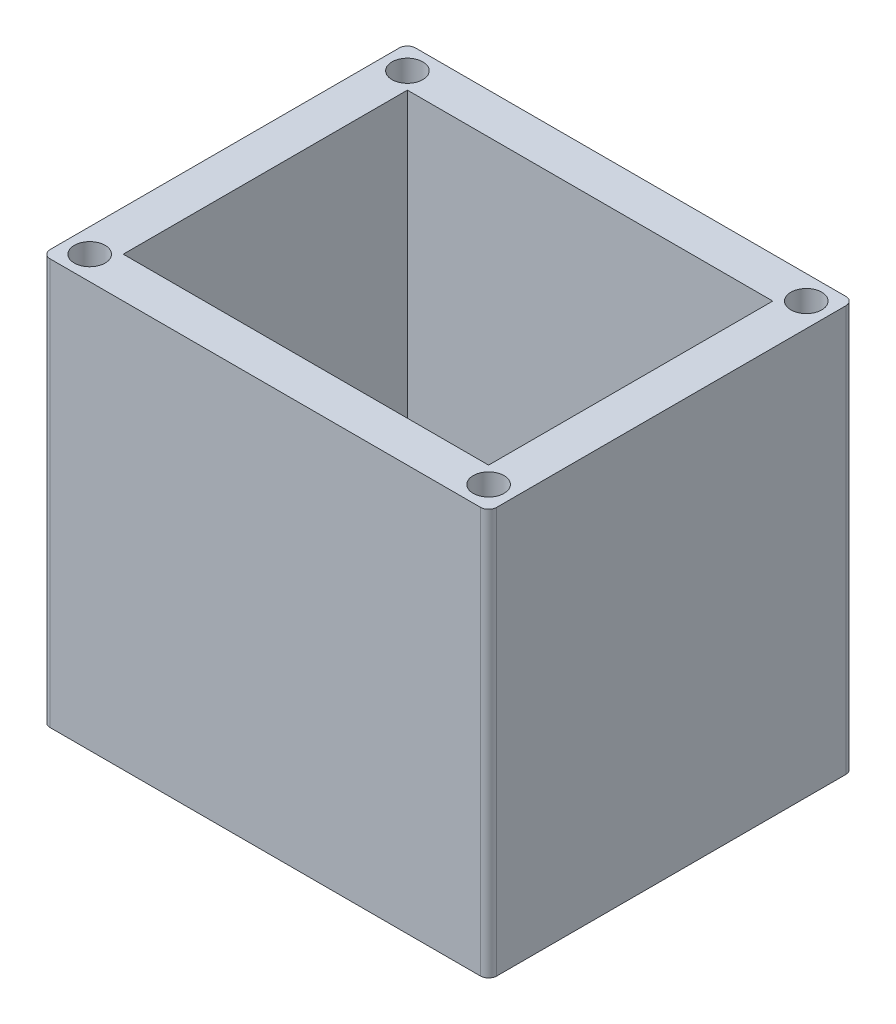
ISO-10303-21;
HEADER;
FILE_DESCRIPTION(('STEP AP214'),'2;1');
FILE_NAME('part.step','',(''),(''),'','','');
FILE_SCHEMA(('AUTOMOTIVE_DESIGN { 1 0 10303 214 1 1 1 1 }'));
ENDSEC;
DATA;
#1=APPLICATION_CONTEXT('core data for automotive mechanical design processes');
#2=APPLICATION_PROTOCOL_DEFINITION('international standard','automotive_design',2000,#1);
#3=PRODUCT_CONTEXT('',#1,'mechanical');
#4=PRODUCT('Part','Part','',(#3));
#5=PRODUCT_RELATED_PRODUCT_CATEGORY('part','',(#4));
#6=PRODUCT_DEFINITION_FORMATION('','',#4);
#7=PRODUCT_DEFINITION_CONTEXT('part definition',#1,'design');
#8=PRODUCT_DEFINITION('design','',#6,#7);
#9=PRODUCT_DEFINITION_SHAPE('','',#8);
#10=(LENGTH_UNIT() NAMED_UNIT(*) SI_UNIT(.MILLI.,.METRE.));
#11=(NAMED_UNIT(*) PLANE_ANGLE_UNIT() SI_UNIT($,.RADIAN.));
#12=(NAMED_UNIT(*) SI_UNIT($,.STERADIAN.) SOLID_ANGLE_UNIT());
#13=UNCERTAINTY_MEASURE_WITH_UNIT(LENGTH_MEASURE(1.E-05),#10,'distance_accuracy_value','');
#14=(GEOMETRIC_REPRESENTATION_CONTEXT(3) GLOBAL_UNCERTAINTY_ASSIGNED_CONTEXT((#13)) GLOBAL_UNIT_ASSIGNED_CONTEXT((#10,
#11,#12)) REPRESENTATION_CONTEXT('',''));
#15=CARTESIAN_POINT('',(0.,0.,0.));
#16=DIRECTION('',(0.,0.,1.));
#17=DIRECTION('',(1.,0.,0.));
#18=AXIS2_PLACEMENT_3D('',#15,#16,#17);
#19=CARTESIAN_POINT('',(0.,50.,45.));
#20=DIRECTION('',(1.,0.,0.));
#21=DIRECTION('',(0.,0.,-1.));
#22=AXIS2_PLACEMENT_3D('',#19,#20,#21);
#23=PLANE('',#22);
#24=DIRECTION('',(0.,1.,0.));
#25=VECTOR('',#24,1.);
#26=CARTESIAN_POINT('',(0.,50.,38.5));
#27=LINE('',#26,#25);
#28=CARTESIAN_POINT('',(0.,13.5172402704764,38.5));
#29=VERTEX_POINT('',#28);
#30=CARTESIAN_POINT('',(0.,6.5,38.5));
#31=VERTEX_POINT('',#30);
#32=EDGE_CURVE('E226',#29,#31,#27,.F.);
#33=ORIENTED_EDGE('',*,*,#32,.T.);
#34=DIRECTION('',(0.,0.,1.));
#35=VECTOR('',#34,1.);
#36=CARTESIAN_POINT('',(0.,6.5,45.));
#37=LINE('',#36,#35);
#38=CARTESIAN_POINT('',(0.,6.5,6.5));
#39=VERTEX_POINT('',#38);
#40=EDGE_CURVE('E232',#31,#39,#37,.F.);
#41=ORIENTED_EDGE('',*,*,#40,.T.);
#42=DIRECTION('',(0.,-1.,0.));
#43=VECTOR('',#42,1.);
#44=CARTESIAN_POINT('',(0.,50.,6.49999999999999));
#45=LINE('',#44,#43);
#46=CARTESIAN_POINT('',(0.,12.9702266472342,6.5));
#47=VERTEX_POINT('',#46);
#48=EDGE_CURVE('E230',#39,#47,#45,.F.);
#49=ORIENTED_EDGE('',*,*,#48,.T.);
#50=DIRECTION('',(0.,-0.0170916787217876,-0.999853926590515));
#51=VECTOR('',#50,1.);
#52=CARTESIAN_POINT('',(0.,13.6389774977629,45.6215617082418));
#53=LINE('',#52,#51);
#54=EDGE_CURVE('E228',#47,#29,#53,.F.);
#55=ORIENTED_EDGE('',*,*,#54,.T.);
#56=EDGE_LOOP('',(#33,#41,#49,#55));
#57=FACE_BOUND('',#56,.T.);
#58=DIRECTION('',(0.,0.,1.));
#59=VECTOR('',#58,1.);
#60=CARTESIAN_POINT('',(0.,0.,45.));
#61=LINE('',#60,#59);
#62=CARTESIAN_POINT('',(0.,0.,1.00000000000001));
#63=VERTEX_POINT('',#62);
#64=CARTESIAN_POINT('',(0.,0.,44.));
#65=VERTEX_POINT('',#64);
#66=EDGE_CURVE('E334',#63,#65,#61,.T.);
#67=ORIENTED_EDGE('',*,*,#66,.T.);
#68=DIRECTION('',(0.,-1.,0.));
#69=VECTOR('',#68,1.);
#70=CARTESIAN_POINT('',(0.,50.,44.));
#71=LINE('',#70,#69);
#72=CARTESIAN_POINT('',(0.,50.,44.));
#73=VERTEX_POINT('',#72);
#74=EDGE_CURVE('E216',#65,#73,#71,.F.);
#75=ORIENTED_EDGE('',*,*,#74,.T.);
#76=DIRECTION('',(0.,0.,1.));
#77=VECTOR('',#76,1.);
#78=CARTESIAN_POINT('',(0.,50.,45.));
#79=LINE('',#78,#77);
#80=CARTESIAN_POINT('',(0.,50.,1.00000000000001));
#81=VERTEX_POINT('',#80);
#82=EDGE_CURVE('E341',#81,#73,#79,.T.);
#83=ORIENTED_EDGE('',*,*,#82,.F.);
#84=DIRECTION('',(0.,-1.,0.));
#85=VECTOR('',#84,1.);
#86=CARTESIAN_POINT('',(0.,50.,1.));
#87=LINE('',#86,#85);
#88=EDGE_CURVE('E213',#81,#63,#87,.T.);
#89=ORIENTED_EDGE('',*,*,#88,.T.);
#90=EDGE_LOOP('',(#67,#75,#83,#89));
#91=FACE_BOUND('',#90,.T.);
#92=ADVANCED_FACE('F37',(#57,#91),#23,.F.);
#93=CARTESIAN_POINT('',(55.,50.,45.));
#94=DIRECTION('',(0.,0.,-1.));
#95=DIRECTION('',(-1.,0.,0.));
#96=AXIS2_PLACEMENT_3D('',#93,#94,#95);
#97=PLANE('',#96);
#98=DIRECTION('',(1.,0.,0.));
#99=VECTOR('',#98,1.);
#100=CARTESIAN_POINT('',(55.,0.,45.));
#101=LINE('',#100,#99);
#102=CARTESIAN_POINT('',(1.00000000000002,0.,45.));
#103=VERTEX_POINT('',#102);
#104=CARTESIAN_POINT('',(54.,0.,45.));
#105=VERTEX_POINT('',#104);
#106=EDGE_CURVE('E355',#103,#105,#101,.T.);
#107=ORIENTED_EDGE('',*,*,#106,.T.);
#108=DIRECTION('',(0.,-1.,0.));
#109=VECTOR('',#108,1.);
#110=CARTESIAN_POINT('',(54.,50.,45.));
#111=LINE('',#110,#109);
#112=CARTESIAN_POINT('',(54.,50.,45.));
#113=VERTEX_POINT('',#112);
#114=EDGE_CURVE('E203',#105,#113,#111,.F.);
#115=ORIENTED_EDGE('',*,*,#114,.T.);
#116=DIRECTION('',(1.,0.,0.));
#117=VECTOR('',#116,1.);
#118=CARTESIAN_POINT('',(55.,50.,45.));
#119=LINE('',#118,#117);
#120=CARTESIAN_POINT('',(1.00000000000002,50.,45.));
#121=VERTEX_POINT('',#120);
#122=EDGE_CURVE('E344',#121,#113,#119,.T.);
#123=ORIENTED_EDGE('',*,*,#122,.F.);
#124=DIRECTION('',(0.,-1.,0.));
#125=VECTOR('',#124,1.);
#126=CARTESIAN_POINT('',(1.00000000000002,50.,45.));
#127=LINE('',#126,#125);
#128=EDGE_CURVE('E200',#121,#103,#127,.T.);
#129=ORIENTED_EDGE('',*,*,#128,.T.);
#130=EDGE_LOOP('',(#107,#115,#123,#129));
#131=FACE_BOUND('',#130,.T.);
#132=ADVANCED_FACE('F385',(#131),#97,.F.);
#133=CARTESIAN_POINT('',(55.,50.,0.));
#134=DIRECTION('',(-1.,0.,0.));
#135=DIRECTION('',(0.,0.,1.));
#136=AXIS2_PLACEMENT_3D('',#133,#134,#135);
#137=PLANE('',#136);
#138=DIRECTION('',(0.,0.,-1.));
#139=VECTOR('',#138,1.);
#140=CARTESIAN_POINT('',(55.,50.,0.));
#141=LINE('',#140,#139);
#142=CARTESIAN_POINT('',(55.,50.,44.));
#143=VERTEX_POINT('',#142);
#144=CARTESIAN_POINT('',(55.,50.,0.999999999999999));
#145=VERTEX_POINT('',#144);
#146=EDGE_CURVE('E348',#143,#145,#141,.T.);
#147=ORIENTED_EDGE('',*,*,#146,.F.);
#148=DIRECTION('',(0.,-1.,0.));
#149=VECTOR('',#148,1.);
#150=CARTESIAN_POINT('',(55.,50.,44.));
#151=LINE('',#150,#149);
#152=CARTESIAN_POINT('',(55.,0.,44.));
#153=VERTEX_POINT('',#152);
#154=EDGE_CURVE('E185',#143,#153,#151,.T.);
#155=ORIENTED_EDGE('',*,*,#154,.T.);
#156=DIRECTION('',(0.,0.,-1.));
#157=VECTOR('',#156,1.);
#158=CARTESIAN_POINT('',(55.,0.,0.));
#159=LINE('',#158,#157);
#160=CARTESIAN_POINT('',(55.,0.,0.999999999999999));
#161=VERTEX_POINT('',#160);
#162=EDGE_CURVE('E358',#153,#161,#159,.T.);
#163=ORIENTED_EDGE('',*,*,#162,.T.);
#164=DIRECTION('',(0.,-1.,0.));
#165=VECTOR('',#164,1.);
#166=CARTESIAN_POINT('',(55.,50.,1.));
#167=LINE('',#166,#165);
#168=EDGE_CURVE('E183',#161,#145,#167,.F.);
#169=ORIENTED_EDGE('',*,*,#168,.T.);
#170=EDGE_LOOP('',(#147,#155,#163,#169));
#171=FACE_BOUND('',#170,.T.);
#172=ADVANCED_FACE('F394',(#171),#137,.F.);
#173=CARTESIAN_POINT('',(0.,50.,0.));
#174=DIRECTION('',(0.,0.,1.));
#175=DIRECTION('',(1.,0.,0.));
#176=AXIS2_PLACEMENT_3D('',#173,#174,#175);
#177=PLANE('',#176);
#178=DIRECTION('',(-1.,0.,0.));
#179=VECTOR('',#178,1.);
#180=CARTESIAN_POINT('',(0.,0.,0.));
#181=LINE('',#180,#179);
#182=CARTESIAN_POINT('',(54.,0.,0.));
#183=VERTEX_POINT('',#182);
#184=CARTESIAN_POINT('',(1.,0.,0.));
#185=VERTEX_POINT('',#184);
#186=EDGE_CURVE('E345',#183,#185,#181,.T.);
#187=ORIENTED_EDGE('',*,*,#186,.T.);
#188=DIRECTION('',(0.,-1.,0.));
#189=VECTOR('',#188,1.);
#190=CARTESIAN_POINT('',(1.,50.,0.));
#191=LINE('',#190,#189);
#192=CARTESIAN_POINT('',(1.,50.,0.));
#193=VERTEX_POINT('',#192);
#194=EDGE_CURVE('E221',#185,#193,#191,.F.);
#195=ORIENTED_EDGE('',*,*,#194,.T.);
#196=DIRECTION('',(-1.,0.,0.));
#197=VECTOR('',#196,1.);
#198=CARTESIAN_POINT('',(0.,50.,0.));
#199=LINE('',#198,#197);
#200=CARTESIAN_POINT('',(54.,50.,0.));
#201=VERTEX_POINT('',#200);
#202=EDGE_CURVE('E174',#201,#193,#199,.T.);
#203=ORIENTED_EDGE('',*,*,#202,.F.);
#204=DIRECTION('',(0.,-1.,0.));
#205=VECTOR('',#204,1.);
#206=CARTESIAN_POINT('',(54.,50.,0.));
#207=LINE('',#206,#205);
#208=EDGE_CURVE('E218',#201,#183,#207,.T.);
#209=ORIENTED_EDGE('',*,*,#208,.T.);
#210=EDGE_LOOP('',(#187,#195,#203,#209));
#211=FACE_BOUND('',#210,.T.);
#212=ADVANCED_FACE('F365',(#211),#177,.F.);
#213=CARTESIAN_POINT('',(0.,50.,0.));
#214=DIRECTION('',(0.,-1.,0.));
#215=DIRECTION('',(0.,0.,-1.));
#216=AXIS2_PLACEMENT_3D('',#213,#214,#215);
#217=PLANE('',#216);
#218=CARTESIAN_POINT('',(2.9352119940451,50.,42.0647880059549));
#219=DIRECTION('',(0.,1.,0.));
#220=DIRECTION('',(0.,0.,1.));
#221=AXIS2_PLACEMENT_3D('',#218,#219,#220);
#222=CIRCLE('',#221,1.9);
#223=CARTESIAN_POINT('',(2.9352119940451,50.,43.9647880059549));
#224=VERTEX_POINT('',#223);
#225=EDGE_CURVE('E298',#224,#224,#222,.T.);
#226=ORIENTED_EDGE('',*,*,#225,.F.);
#227=EDGE_LOOP('',(#226));
#228=FACE_BOUND('',#227,.T.);
#229=CARTESIAN_POINT('',(52.0647880059549,50.,42.0647880059549));
#230=DIRECTION('',(0.,1.,0.));
#231=DIRECTION('',(0.,0.,1.));
#232=AXIS2_PLACEMENT_3D('',#229,#230,#231);
#233=CIRCLE('',#232,1.9);
#234=CARTESIAN_POINT('',(52.0647880059549,50.,43.9647880059549));
#235=VERTEX_POINT('',#234);
#236=EDGE_CURVE('E292',#235,#235,#233,.T.);
#237=ORIENTED_EDGE('',*,*,#236,.F.);
#238=EDGE_LOOP('',(#237));
#239=FACE_BOUND('',#238,.T.);
#240=CARTESIAN_POINT('',(52.0647880059549,50.,2.9352119940451));
#241=DIRECTION('',(0.,1.,0.));
#242=DIRECTION('',(0.,0.,1.));
#243=AXIS2_PLACEMENT_3D('',#240,#241,#242);
#244=CIRCLE('',#243,1.9);
#245=CARTESIAN_POINT('',(52.0647880059549,50.,4.8352119940451));
#246=VERTEX_POINT('',#245);
#247=EDGE_CURVE('E285',#246,#246,#244,.T.);
#248=ORIENTED_EDGE('',*,*,#247,.F.);
#249=EDGE_LOOP('',(#248));
#250=FACE_BOUND('',#249,.T.);
#251=CARTESIAN_POINT('',(2.93521199404509,50.,2.9352119940451));
#252=DIRECTION('',(0.,1.,0.));
#253=DIRECTION('',(0.,0.,1.));
#254=AXIS2_PLACEMENT_3D('',#251,#252,#253);
#255=CIRCLE('',#254,1.9);
#256=CARTESIAN_POINT('',(2.93521199404509,50.,4.8352119940451));
#257=VERTEX_POINT('',#256);
#258=EDGE_CURVE('E288',#257,#257,#255,.T.);
#259=ORIENTED_EDGE('',*,*,#258,.F.);
#260=EDGE_LOOP('',(#259));
#261=FACE_BOUND('',#260,.T.);
#262=DIRECTION('',(0.,0.,1.));
#263=VECTOR('',#262,1.);
#264=CARTESIAN_POINT('',(5.,50.,5.00000000000001));
#265=LINE('',#264,#263);
#266=CARTESIAN_POINT('',(5.,50.,5.00000000000001));
#267=VERTEX_POINT('',#266);
#268=CARTESIAN_POINT('',(5.,50.,40.));
#269=VERTEX_POINT('',#268);
#270=EDGE_CURVE('E324',#267,#269,#265,.T.);
#271=ORIENTED_EDGE('',*,*,#270,.F.);
#272=DIRECTION('',(-1.,0.,0.));
#273=VECTOR('',#272,1.);
#274=CARTESIAN_POINT('',(50.,50.,5.));
#275=LINE('',#274,#273);
#276=CARTESIAN_POINT('',(50.,50.,5.));
#277=VERTEX_POINT('',#276);
#278=EDGE_CURVE('E306',#277,#267,#275,.T.);
#279=ORIENTED_EDGE('',*,*,#278,.F.);
#280=DIRECTION('',(0.,0.,-1.));
#281=VECTOR('',#280,1.);
#282=CARTESIAN_POINT('',(50.,50.,40.));
#283=LINE('',#282,#281);
#284=CARTESIAN_POINT('',(50.,50.,40.));
#285=VERTEX_POINT('',#284);
#286=EDGE_CURVE('E313',#285,#277,#283,.T.);
#287=ORIENTED_EDGE('',*,*,#286,.F.);
#288=DIRECTION('',(1.,0.,0.));
#289=VECTOR('',#288,1.);
#290=CARTESIAN_POINT('',(5.,50.,40.));
#291=LINE('',#290,#289);
#292=EDGE_CURVE('E327',#269,#285,#291,.T.);
#293=ORIENTED_EDGE('',*,*,#292,.F.);
#294=EDGE_LOOP('',(#271,#279,#287,#293));
#295=FACE_BOUND('',#294,.T.);
#296=ORIENTED_EDGE('',*,*,#122,.T.);
#297=CARTESIAN_POINT('',(54.,50.,44.));
#298=DIRECTION('',(0.,-1.,0.));
#299=DIRECTION('',(0.,0.,-1.));
#300=AXIS2_PLACEMENT_3D('',#297,#298,#299);
#301=CIRCLE('',#300,1.);
#302=EDGE_CURVE('E211',#113,#143,#301,.F.);
#303=ORIENTED_EDGE('',*,*,#302,.T.);
#304=ORIENTED_EDGE('',*,*,#146,.T.);
#305=CARTESIAN_POINT('',(54.,50.,1.));
#306=DIRECTION('',(0.,-1.,0.));
#307=DIRECTION('',(0.,0.,-1.));
#308=AXIS2_PLACEMENT_3D('',#305,#306,#307);
#309=CIRCLE('',#308,1.);
#310=EDGE_CURVE('E205',#145,#201,#309,.F.);
#311=ORIENTED_EDGE('',*,*,#310,.T.);
#312=ORIENTED_EDGE('',*,*,#202,.T.);
#313=CARTESIAN_POINT('',(1.,50.,1.));
#314=DIRECTION('',(0.,-1.,0.));
#315=DIRECTION('',(0.,0.,-1.));
#316=AXIS2_PLACEMENT_3D('',#313,#314,#315);
#317=CIRCLE('',#316,1.);
#318=EDGE_CURVE('E207',#193,#81,#317,.F.);
#319=ORIENTED_EDGE('',*,*,#318,.T.);
#320=ORIENTED_EDGE('',*,*,#82,.T.);
#321=CARTESIAN_POINT('',(1.00000000000002,50.,44.));
#322=DIRECTION('',(0.,-1.,0.));
#323=DIRECTION('',(0.,0.,-1.));
#324=AXIS2_PLACEMENT_3D('',#321,#322,#323);
#325=CIRCLE('',#324,1.);
#326=EDGE_CURVE('E209',#73,#121,#325,.F.);
#327=ORIENTED_EDGE('',*,*,#326,.T.);
#328=EDGE_LOOP('',(#296,#303,#304,#311,#312,#319,#320,#327));
#329=FACE_BOUND('',#328,.T.);
#330=ADVANCED_FACE('F375',(#228,#239,#250,#261,#295,#329),#217,.F.);
#331=CARTESIAN_POINT('',(0.,0.,0.));
#332=DIRECTION('',(0.,-1.,0.));
#333=DIRECTION('',(0.,0.,-1.));
#334=AXIS2_PLACEMENT_3D('',#331,#332,#333);
#335=PLANE('',#334);
#336=CARTESIAN_POINT('',(13.75,0.,22.5));
#337=DIRECTION('',(0.,-1.,0.));
#338=DIRECTION('',(0.,0.,-1.));
#339=AXIS2_PLACEMENT_3D('',#336,#337,#338);
#340=CIRCLE('',#339,1.6);
#341=CARTESIAN_POINT('',(13.75,0.,20.9));
#342=VERTEX_POINT('',#341);
#343=EDGE_CURVE('E281',#342,#342,#340,.T.);
#344=ORIENTED_EDGE('',*,*,#343,.F.);
#345=EDGE_LOOP('',(#344));
#346=FACE_BOUND('',#345,.T.);
#347=CARTESIAN_POINT('',(41.25,0.,22.5));
#348=DIRECTION('',(0.,-1.,0.));
#349=DIRECTION('',(0.,0.,-1.));
#350=AXIS2_PLACEMENT_3D('',#347,#348,#349);
#351=CIRCLE('',#350,1.6);
#352=CARTESIAN_POINT('',(41.25,0.,20.9));
#353=VERTEX_POINT('',#352);
#354=EDGE_CURVE('E276',#353,#353,#351,.T.);
#355=ORIENTED_EDGE('',*,*,#354,.F.);
#356=EDGE_LOOP('',(#355));
#357=FACE_BOUND('',#356,.T.);
#358=ORIENTED_EDGE('',*,*,#162,.F.);
#359=CARTESIAN_POINT('',(54.,0.,44.));
#360=DIRECTION('',(0.,-1.,0.));
#361=DIRECTION('',(0.,0.,-1.));
#362=AXIS2_PLACEMENT_3D('',#359,#360,#361);
#363=CIRCLE('',#362,1.);
#364=EDGE_CURVE('E198',#153,#105,#363,.T.);
#365=ORIENTED_EDGE('',*,*,#364,.T.);
#366=ORIENTED_EDGE('',*,*,#106,.F.);
#367=CARTESIAN_POINT('',(1.00000000000002,0.,44.));
#368=DIRECTION('',(0.,-1.,0.));
#369=DIRECTION('',(0.,0.,-1.));
#370=AXIS2_PLACEMENT_3D('',#367,#368,#369);
#371=CIRCLE('',#370,1.);
#372=EDGE_CURVE('E196',#103,#65,#371,.T.);
#373=ORIENTED_EDGE('',*,*,#372,.T.);
#374=ORIENTED_EDGE('',*,*,#66,.F.);
#375=CARTESIAN_POINT('',(1.,0.,1.));
#376=DIRECTION('',(0.,-1.,0.));
#377=DIRECTION('',(0.,0.,-1.));
#378=AXIS2_PLACEMENT_3D('',#375,#376,#377);
#379=CIRCLE('',#378,1.);
#380=EDGE_CURVE('E194',#63,#185,#379,.T.);
#381=ORIENTED_EDGE('',*,*,#380,.T.);
#382=ORIENTED_EDGE('',*,*,#186,.F.);
#383=CARTESIAN_POINT('',(54.,0.,1.));
#384=DIRECTION('',(0.,-1.,0.));
#385=DIRECTION('',(0.,0.,-1.));
#386=AXIS2_PLACEMENT_3D('',#383,#384,#385);
#387=CIRCLE('',#386,1.);
#388=EDGE_CURVE('E192',#183,#161,#387,.T.);
#389=ORIENTED_EDGE('',*,*,#388,.T.);
#390=EDGE_LOOP('',(#358,#365,#366,#373,#374,#381,#382,#389));
#391=FACE_BOUND('',#390,.T.);
#392=ADVANCED_FACE('F399',(#346,#357,#391),#335,.T.);
#393=CARTESIAN_POINT('',(50.,5.,5.));
#394=DIRECTION('',(0.,0.,-1.));
#395=DIRECTION('',(-1.,0.,0.));
#396=AXIS2_PLACEMENT_3D('',#393,#394,#395);
#397=PLANE('',#396);
#398=ORIENTED_EDGE('',*,*,#278,.T.);
#399=DIRECTION('',(0.,1.,0.));
#400=VECTOR('',#399,1.);
#401=CARTESIAN_POINT('',(5.,5.,5.00000000000001));
#402=LINE('',#401,#400);
#403=CARTESIAN_POINT('',(5.,5.,5.00000000000001));
#404=VERTEX_POINT('',#403);
#405=EDGE_CURVE('E322',#404,#267,#402,.T.);
#406=ORIENTED_EDGE('',*,*,#405,.F.);
#407=DIRECTION('',(-1.,0.,0.));
#408=VECTOR('',#407,1.);
#409=CARTESIAN_POINT('',(50.,5.,5.));
#410=LINE('',#409,#408);
#411=CARTESIAN_POINT('',(50.,5.,5.));
#412=VERTEX_POINT('',#411);
#413=EDGE_CURVE('E309',#412,#404,#410,.T.);
#414=ORIENTED_EDGE('',*,*,#413,.F.);
#415=DIRECTION('',(0.,1.,0.));
#416=VECTOR('',#415,1.);
#417=CARTESIAN_POINT('',(50.,5.,5.));
#418=LINE('',#417,#416);
#419=EDGE_CURVE('E332',#412,#277,#418,.T.);
#420=ORIENTED_EDGE('',*,*,#419,.T.);
#421=EDGE_LOOP('',(#398,#406,#414,#420));
#422=FACE_BOUND('',#421,.T.);
#423=ADVANCED_FACE('F401',(#422),#397,.F.);
#424=CARTESIAN_POINT('',(50.,5.,40.));
#425=DIRECTION('',(1.,0.,0.));
#426=DIRECTION('',(0.,0.,-1.));
#427=AXIS2_PLACEMENT_3D('',#424,#425,#426);
#428=PLANE('',#427);
#429=ORIENTED_EDGE('',*,*,#286,.T.);
#430=ORIENTED_EDGE('',*,*,#419,.F.);
#431=DIRECTION('',(0.,0.,-1.));
#432=VECTOR('',#431,1.);
#433=CARTESIAN_POINT('',(50.,5.,40.));
#434=LINE('',#433,#432);
#435=CARTESIAN_POINT('',(50.,5.,40.));
#436=VERTEX_POINT('',#435);
#437=EDGE_CURVE('E319',#436,#412,#434,.T.);
#438=ORIENTED_EDGE('',*,*,#437,.F.);
#439=DIRECTION('',(0.,1.,0.));
#440=VECTOR('',#439,1.);
#441=CARTESIAN_POINT('',(50.,5.,40.));
#442=LINE('',#441,#440);
#443=EDGE_CURVE('E335',#436,#285,#442,.T.);
#444=ORIENTED_EDGE('',*,*,#443,.T.);
#445=EDGE_LOOP('',(#429,#430,#438,#444));
#446=FACE_BOUND('',#445,.T.);
#447=ADVANCED_FACE('F408',(#446),#428,.F.);
#448=CARTESIAN_POINT('',(5.,5.,40.));
#449=DIRECTION('',(0.,0.,1.));
#450=DIRECTION('',(1.,0.,0.));
#451=AXIS2_PLACEMENT_3D('',#448,#449,#450);
#452=PLANE('',#451);
#453=ORIENTED_EDGE('',*,*,#292,.T.);
#454=ORIENTED_EDGE('',*,*,#443,.F.);
#455=DIRECTION('',(1.,0.,0.));
#456=VECTOR('',#455,1.);
#457=CARTESIAN_POINT('',(5.,5.,40.));
#458=LINE('',#457,#456);
#459=CARTESIAN_POINT('',(5.,5.,40.));
#460=VERTEX_POINT('',#459);
#461=EDGE_CURVE('E316',#460,#436,#458,.T.);
#462=ORIENTED_EDGE('',*,*,#461,.F.);
#463=DIRECTION('',(0.,1.,0.));
#464=VECTOR('',#463,1.);
#465=CARTESIAN_POINT('',(5.,5.,40.));
#466=LINE('',#465,#464);
#467=EDGE_CURVE('E337',#460,#269,#466,.T.);
#468=ORIENTED_EDGE('',*,*,#467,.T.);
#469=EDGE_LOOP('',(#453,#454,#462,#468));
#470=FACE_BOUND('',#469,.T.);
#471=ADVANCED_FACE('F576',(#470),#452,.F.);
#472=CARTESIAN_POINT('',(5.,5.,5.00000000000001));
#473=DIRECTION('',(-1.,0.,0.));
#474=DIRECTION('',(0.,0.,1.));
#475=AXIS2_PLACEMENT_3D('',#472,#473,#474);
#476=PLANE('',#475);
#477=DIRECTION('',(0.,1.,0.));
#478=VECTOR('',#477,1.);
#479=CARTESIAN_POINT('',(5.,5.,37.5));
#480=LINE('',#479,#478);
#481=CARTESIAN_POINT('',(5.,7.5,37.5));
#482=VERTEX_POINT('',#481);
#483=CARTESIAN_POINT('',(5.,12.5,37.5));
#484=VERTEX_POINT('',#483);
#485=EDGE_CURVE('E182',#482,#484,#480,.T.);
#486=ORIENTED_EDGE('',*,*,#485,.T.);
#487=DIRECTION('',(0.,-0.0170916787217876,-0.999853926590515));
#488=VECTOR('',#487,1.);
#489=CARTESIAN_POINT('',(5.,11.9424106412234,4.88132521253467));
#490=LINE('',#489,#488);
#491=CARTESIAN_POINT('',(5.,11.9871747282105,7.5));
#492=VERTEX_POINT('',#491);
#493=EDGE_CURVE('E177',#484,#492,#490,.T.);
#494=ORIENTED_EDGE('',*,*,#493,.T.);
#495=DIRECTION('',(0.,-1.,0.));
#496=VECTOR('',#495,1.);
#497=CARTESIAN_POINT('',(5.,5.00000000000001,7.5));
#498=LINE('',#497,#496);
#499=CARTESIAN_POINT('',(5.,7.5,7.5));
#500=VERTEX_POINT('',#499);
#501=EDGE_CURVE('E163',#492,#500,#498,.T.);
#502=ORIENTED_EDGE('',*,*,#501,.T.);
#503=DIRECTION('',(0.,0.,1.));
#504=VECTOR('',#503,1.);
#505=CARTESIAN_POINT('',(5.,7.5,5.00000000000001));
#506=LINE('',#505,#504);
#507=EDGE_CURVE('E173',#500,#482,#506,.T.);
#508=ORIENTED_EDGE('',*,*,#507,.T.);
#509=EDGE_LOOP('',(#486,#494,#502,#508));
#510=FACE_BOUND('',#509,.T.);
#511=ORIENTED_EDGE('',*,*,#270,.T.);
#512=ORIENTED_EDGE('',*,*,#467,.F.);
#513=DIRECTION('',(0.,0.,1.));
#514=VECTOR('',#513,1.);
#515=CARTESIAN_POINT('',(5.,5.,5.00000000000001));
#516=LINE('',#515,#514);
#517=EDGE_CURVE('E312',#404,#460,#516,.T.);
#518=ORIENTED_EDGE('',*,*,#517,.F.);
#519=ORIENTED_EDGE('',*,*,#405,.T.);
#520=EDGE_LOOP('',(#511,#512,#518,#519));
#521=FACE_BOUND('',#520,.T.);
#522=ADVANCED_FACE('F180',(#510,#521),#476,.F.);
#523=CARTESIAN_POINT('',(0.,5.,0.));
#524=DIRECTION('',(0.,1.,0.));
#525=DIRECTION('',(0.,0.,1.));
#526=AXIS2_PLACEMENT_3D('',#523,#524,#525);
#527=PLANE('',#526);
#528=CARTESIAN_POINT('',(13.75,5.,22.5));
#529=DIRECTION('',(0.,1.,0.));
#530=DIRECTION('',(0.,0.,1.));
#531=AXIS2_PLACEMENT_3D('',#528,#529,#530);
#532=CIRCLE('',#531,1.6);
#533=CARTESIAN_POINT('',(13.75,5.,24.1));
#534=VERTEX_POINT('',#533);
#535=EDGE_CURVE('E273',#534,#534,#532,.T.);
#536=ORIENTED_EDGE('',*,*,#535,.F.);
#537=EDGE_LOOP('',(#536));
#538=FACE_BOUND('',#537,.T.);
#539=CARTESIAN_POINT('',(41.25,5.,22.5));
#540=DIRECTION('',(0.,1.,0.));
#541=DIRECTION('',(0.,0.,1.));
#542=AXIS2_PLACEMENT_3D('',#539,#540,#541);
#543=CIRCLE('',#542,1.6);
#544=CARTESIAN_POINT('',(41.25,5.,24.1));
#545=VERTEX_POINT('',#544);
#546=EDGE_CURVE('E269',#545,#545,#543,.T.);
#547=ORIENTED_EDGE('',*,*,#546,.F.);
#548=EDGE_LOOP('',(#547));
#549=FACE_BOUND('',#548,.T.);
#550=ORIENTED_EDGE('',*,*,#413,.T.);
#551=ORIENTED_EDGE('',*,*,#517,.T.);
#552=ORIENTED_EDGE('',*,*,#461,.T.);
#553=ORIENTED_EDGE('',*,*,#437,.T.);
#554=EDGE_LOOP('',(#550,#551,#552,#553));
#555=FACE_BOUND('',#554,.T.);
#556=ADVANCED_FACE('F562',(#538,#549,#555),#527,.T.);
#557=CARTESIAN_POINT('',(2.93521199404509,30.,2.9352119940451));
#558=DIRECTION('',(0.,1.,0.));
#559=DIRECTION('',(0.,0.,1.));
#560=AXIS2_PLACEMENT_3D('',#557,#558,#559);
#561=CYLINDRICAL_SURFACE('',#560,1.9);
#562=CARTESIAN_POINT('',(2.93521199404509,30.,2.9352119940451));
#563=DIRECTION('',(0.,1.,0.));
#564=DIRECTION('',(0.,0.,1.));
#565=AXIS2_PLACEMENT_3D('',#562,#563,#564);
#566=CIRCLE('',#565,1.9);
#567=CARTESIAN_POINT('',(2.93521199404509,30.,4.8352119940451));
#568=VERTEX_POINT('',#567);
#569=EDGE_CURVE('E303',#568,#568,#566,.T.);
#570=ORIENTED_EDGE('',*,*,#569,.F.);
#571=EDGE_LOOP('',(#570));
#572=FACE_BOUND('',#571,.T.);
#573=ORIENTED_EDGE('',*,*,#258,.T.);
#574=EDGE_LOOP('',(#573));
#575=FACE_BOUND('',#574,.T.);
#576=ADVANCED_FACE('F554',(#572,#575),#561,.F.);
#577=CARTESIAN_POINT('',(2.93521199404509,30.,2.9352119940451));
#578=DIRECTION('',(0.,1.,0.));
#579=DIRECTION('',(0.,0.,1.));
#580=AXIS2_PLACEMENT_3D('',#577,#578,#579);
#581=PLANE('',#580);
#582=ORIENTED_EDGE('',*,*,#569,.T.);
#583=EDGE_LOOP('',(#582));
#584=FACE_BOUND('',#583,.T.);
#585=ADVANCED_FACE('F546',(#584),#581,.T.);
#586=CARTESIAN_POINT('',(52.0647880059549,30.,2.9352119940451));
#587=DIRECTION('',(0.,1.,0.));
#588=DIRECTION('',(0.,0.,1.));
#589=AXIS2_PLACEMENT_3D('',#586,#587,#588);
#590=CYLINDRICAL_SURFACE('',#589,1.9);
#591=CARTESIAN_POINT('',(52.0647880059549,30.,2.9352119940451));
#592=DIRECTION('',(0.,1.,0.));
#593=DIRECTION('',(0.,0.,1.));
#594=AXIS2_PLACEMENT_3D('',#591,#592,#593);
#595=CIRCLE('',#594,1.9);
#596=CARTESIAN_POINT('',(52.0647880059549,30.,4.8352119940451));
#597=VERTEX_POINT('',#596);
#598=EDGE_CURVE('E289',#597,#597,#595,.T.);
#599=ORIENTED_EDGE('',*,*,#598,.F.);
#600=EDGE_LOOP('',(#599));
#601=FACE_BOUND('',#600,.T.);
#602=ORIENTED_EDGE('',*,*,#247,.T.);
#603=EDGE_LOOP('',(#602));
#604=FACE_BOUND('',#603,.T.);
#605=ADVANCED_FACE('F538',(#601,#604),#590,.F.);
#606=CARTESIAN_POINT('',(52.0647880059549,30.,2.9352119940451));
#607=DIRECTION('',(0.,1.,0.));
#608=DIRECTION('',(0.,0.,1.));
#609=AXIS2_PLACEMENT_3D('',#606,#607,#608);
#610=PLANE('',#609);
#611=ORIENTED_EDGE('',*,*,#598,.T.);
#612=EDGE_LOOP('',(#611));
#613=FACE_BOUND('',#612,.T.);
#614=ADVANCED_FACE('F530',(#613),#610,.T.);
#615=CARTESIAN_POINT('',(52.0647880059549,30.,42.0647880059549));
#616=DIRECTION('',(0.,1.,0.));
#617=DIRECTION('',(0.,0.,1.));
#618=AXIS2_PLACEMENT_3D('',#615,#616,#617);
#619=CYLINDRICAL_SURFACE('',#618,1.9);
#620=CARTESIAN_POINT('',(52.0647880059549,30.,42.0647880059549));
#621=DIRECTION('',(0.,1.,0.));
#622=DIRECTION('',(0.,0.,1.));
#623=AXIS2_PLACEMENT_3D('',#620,#621,#622);
#624=CIRCLE('',#623,1.9);
#625=CARTESIAN_POINT('',(52.0647880059549,30.,43.9647880059549));
#626=VERTEX_POINT('',#625);
#627=EDGE_CURVE('E295',#626,#626,#624,.T.);
#628=ORIENTED_EDGE('',*,*,#627,.F.);
#629=EDGE_LOOP('',(#628));
#630=FACE_BOUND('',#629,.T.);
#631=ORIENTED_EDGE('',*,*,#236,.T.);
#632=EDGE_LOOP('',(#631));
#633=FACE_BOUND('',#632,.T.);
#634=ADVANCED_FACE('F522',(#630,#633),#619,.F.);
#635=CARTESIAN_POINT('',(52.0647880059549,30.,42.0647880059549));
#636=DIRECTION('',(0.,1.,0.));
#637=DIRECTION('',(0.,0.,1.));
#638=AXIS2_PLACEMENT_3D('',#635,#636,#637);
#639=PLANE('',#638);
#640=ORIENTED_EDGE('',*,*,#627,.T.);
#641=EDGE_LOOP('',(#640));
#642=FACE_BOUND('',#641,.T.);
#643=ADVANCED_FACE('F514',(#642),#639,.T.);
#644=CARTESIAN_POINT('',(2.9352119940451,30.,42.0647880059549));
#645=DIRECTION('',(0.,1.,0.));
#646=DIRECTION('',(0.,0.,1.));
#647=AXIS2_PLACEMENT_3D('',#644,#645,#646);
#648=CYLINDRICAL_SURFACE('',#647,1.9);
#649=CARTESIAN_POINT('',(2.9352119940451,30.,42.0647880059549));
#650=DIRECTION('',(0.,1.,0.));
#651=DIRECTION('',(0.,0.,1.));
#652=AXIS2_PLACEMENT_3D('',#649,#650,#651);
#653=CIRCLE('',#652,1.9);
#654=CARTESIAN_POINT('',(2.9352119940451,30.,43.9647880059549));
#655=VERTEX_POINT('',#654);
#656=EDGE_CURVE('E284',#655,#655,#653,.T.);
#657=ORIENTED_EDGE('',*,*,#656,.F.);
#658=EDGE_LOOP('',(#657));
#659=FACE_BOUND('',#658,.T.);
#660=ORIENTED_EDGE('',*,*,#225,.T.);
#661=EDGE_LOOP('',(#660));
#662=FACE_BOUND('',#661,.T.);
#663=ADVANCED_FACE('F506',(#659,#662),#648,.F.);
#664=CARTESIAN_POINT('',(2.9352119940451,30.,42.0647880059549));
#665=DIRECTION('',(0.,1.,0.));
#666=DIRECTION('',(0.,0.,1.));
#667=AXIS2_PLACEMENT_3D('',#664,#665,#666);
#668=PLANE('',#667);
#669=ORIENTED_EDGE('',*,*,#656,.T.);
#670=EDGE_LOOP('',(#669));
#671=FACE_BOUND('',#670,.T.);
#672=ADVANCED_FACE('F497',(#671),#668,.T.);
#673=CARTESIAN_POINT('',(41.25,-5.,22.5));
#674=DIRECTION('',(0.,1.,0.));
#675=DIRECTION('',(0.,0.,1.));
#676=AXIS2_PLACEMENT_3D('',#673,#674,#675);
#677=CYLINDRICAL_SURFACE('',#676,1.6);
#678=ORIENTED_EDGE('',*,*,#354,.T.);
#679=EDGE_LOOP('',(#678));
#680=FACE_BOUND('',#679,.T.);
#681=ORIENTED_EDGE('',*,*,#546,.T.);
#682=EDGE_LOOP('',(#681));
#683=FACE_BOUND('',#682,.T.);
#684=ADVANCED_FACE('F488',(#680,#683),#677,.F.);
#685=CARTESIAN_POINT('',(13.75,-5.,22.5));
#686=DIRECTION('',(0.,1.,0.));
#687=DIRECTION('',(0.,0.,1.));
#688=AXIS2_PLACEMENT_3D('',#685,#686,#687);
#689=CYLINDRICAL_SURFACE('',#688,1.6);
#690=ORIENTED_EDGE('',*,*,#343,.T.);
#691=EDGE_LOOP('',(#690));
#692=FACE_BOUND('',#691,.T.);
#693=ORIENTED_EDGE('',*,*,#535,.T.);
#694=EDGE_LOOP('',(#693));
#695=FACE_BOUND('',#694,.T.);
#696=ADVANCED_FACE('F481',(#692,#695),#689,.F.);
#697=CARTESIAN_POINT('',(10.,12.5,37.5));
#698=DIRECTION('',(0.,0.999853926590515,-0.0170916787217876));
#699=DIRECTION('',(0.,0.0170916787217876,0.999853926590515));
#700=AXIS2_PLACEMENT_3D('',#697,#698,#699);
#701=PLANE('',#700);
#702=DIRECTION('',(-1.,0.,0.));
#703=VECTOR('',#702,1.);
#704=CARTESIAN_POINT('',(10.,12.5,37.5));
#705=LINE('',#704,#703);
#706=CARTESIAN_POINT('',(1.00000000000002,12.5,37.5));
#707=VERTEX_POINT('',#706);
#708=EDGE_CURVE('E267',#484,#707,#705,.T.);
#709=ORIENTED_EDGE('',*,*,#708,.T.);
#710=DIRECTION('',(0.,-0.0170916787217876,-0.999853926590515));
#711=VECTOR('',#710,1.);
#712=CARTESIAN_POINT('',(1.00000000000002,12.5,37.5));
#713=LINE('',#712,#711);
#714=CARTESIAN_POINT('',(1.,11.9871747282105,7.5));
#715=VERTEX_POINT('',#714);
#716=EDGE_CURVE('E46',#707,#715,#713,.T.);
#717=ORIENTED_EDGE('',*,*,#716,.T.);
#718=DIRECTION('',(-1.,0.,0.));
#719=VECTOR('',#718,1.);
#720=CARTESIAN_POINT('',(10.,11.9871747282105,7.5));
#721=LINE('',#720,#719);
#722=EDGE_CURVE('E165',#492,#715,#721,.T.);
#723=ORIENTED_EDGE('',*,*,#722,.F.);
#724=ORIENTED_EDGE('',*,*,#493,.F.);
#725=EDGE_LOOP('',(#709,#717,#723,#724));
#726=FACE_BOUND('',#725,.T.);
#727=ADVANCED_FACE('F176',(#726),#701,.F.);
#728=CARTESIAN_POINT('',(10.,7.5,37.5));
#729=DIRECTION('',(0.,0.,1.));
#730=DIRECTION('',(1.,0.,0.));
#731=AXIS2_PLACEMENT_3D('',#728,#729,#730);
#732=PLANE('',#731);
#733=DIRECTION('',(-1.,0.,0.));
#734=VECTOR('',#733,1.);
#735=CARTESIAN_POINT('',(10.,7.5,37.5));
#736=LINE('',#735,#734);
#737=CARTESIAN_POINT('',(1.00000000000002,7.5,37.5));
#738=VERTEX_POINT('',#737);
#739=EDGE_CURVE('E265',#482,#738,#736,.T.);
#740=ORIENTED_EDGE('',*,*,#739,.T.);
#741=DIRECTION('',(0.,1.,0.));
#742=VECTOR('',#741,1.);
#743=CARTESIAN_POINT('',(1.00000000000002,7.5,37.5));
#744=LINE('',#743,#742);
#745=EDGE_CURVE('E11',#738,#707,#744,.T.);
#746=ORIENTED_EDGE('',*,*,#745,.T.);
#747=ORIENTED_EDGE('',*,*,#708,.F.);
#748=ORIENTED_EDGE('',*,*,#485,.F.);
#749=EDGE_LOOP('',(#740,#746,#747,#748));
#750=FACE_BOUND('',#749,.T.);
#751=ADVANCED_FACE('F266',(#750),#732,.F.);
#752=CARTESIAN_POINT('',(10.,7.5,7.5));
#753=DIRECTION('',(0.,-1.,0.));
#754=DIRECTION('',(0.,0.,-1.));
#755=AXIS2_PLACEMENT_3D('',#752,#753,#754);
#756=PLANE('',#755);
#757=DIRECTION('',(-1.,0.,0.));
#758=VECTOR('',#757,1.);
#759=CARTESIAN_POINT('',(10.,7.5,7.5));
#760=LINE('',#759,#758);
#761=CARTESIAN_POINT('',(1.,7.5,7.5));
#762=VERTEX_POINT('',#761);
#763=EDGE_CURVE('E168',#500,#762,#760,.T.);
#764=ORIENTED_EDGE('',*,*,#763,.T.);
#765=DIRECTION('',(0.,0.,1.));
#766=VECTOR('',#765,1.);
#767=CARTESIAN_POINT('',(1.,7.5,7.5));
#768=LINE('',#767,#766);
#769=EDGE_CURVE('E223',#762,#738,#768,.T.);
#770=ORIENTED_EDGE('',*,*,#769,.T.);
#771=ORIENTED_EDGE('',*,*,#739,.F.);
#772=ORIENTED_EDGE('',*,*,#507,.F.);
#773=EDGE_LOOP('',(#764,#770,#771,#772));
#774=FACE_BOUND('',#773,.T.);
#775=ADVANCED_FACE('F264',(#774),#756,.F.);
#776=CARTESIAN_POINT('',(10.,11.9871747282105,7.5));
#777=DIRECTION('',(0.,0.,-1.));
#778=DIRECTION('',(-1.,0.,0.));
#779=AXIS2_PLACEMENT_3D('',#776,#777,#778);
#780=PLANE('',#779);
#781=ORIENTED_EDGE('',*,*,#722,.T.);
#782=DIRECTION('',(0.,-1.,0.));
#783=VECTOR('',#782,1.);
#784=CARTESIAN_POINT('',(1.,11.9871747282105,7.5));
#785=LINE('',#784,#783);
#786=EDGE_CURVE('E235',#715,#762,#785,.T.);
#787=ORIENTED_EDGE('',*,*,#786,.T.);
#788=ORIENTED_EDGE('',*,*,#763,.F.);
#789=ORIENTED_EDGE('',*,*,#501,.F.);
#790=EDGE_LOOP('',(#781,#787,#788,#789));
#791=FACE_BOUND('',#790,.T.);
#792=ADVANCED_FACE('F164',(#791),#780,.F.);
#793=CARTESIAN_POINT('',(54.,50.,44.));
#794=DIRECTION('',(0.,-1.,0.));
#795=DIRECTION('',(0.,0.,-1.));
#796=AXIS2_PLACEMENT_3D('',#793,#794,#795);
#797=CYLINDRICAL_SURFACE('',#796,1.);
#798=ORIENTED_EDGE('',*,*,#302,.F.);
#799=ORIENTED_EDGE('',*,*,#114,.F.);
#800=ORIENTED_EDGE('',*,*,#364,.F.);
#801=ORIENTED_EDGE('',*,*,#154,.F.);
#802=EDGE_LOOP('',(#798,#799,#800,#801));
#803=FACE_BOUND('',#802,.T.);
#804=ADVANCED_FACE('F389',(#803),#797,.T.);
#805=CARTESIAN_POINT('',(1.00000000000002,50.,44.));
#806=DIRECTION('',(0.,-1.,0.));
#807=DIRECTION('',(0.,0.,-1.));
#808=AXIS2_PLACEMENT_3D('',#805,#806,#807);
#809=CYLINDRICAL_SURFACE('',#808,1.);
#810=ORIENTED_EDGE('',*,*,#326,.F.);
#811=ORIENTED_EDGE('',*,*,#74,.F.);
#812=ORIENTED_EDGE('',*,*,#372,.F.);
#813=ORIENTED_EDGE('',*,*,#128,.F.);
#814=EDGE_LOOP('',(#810,#811,#812,#813));
#815=FACE_BOUND('',#814,.T.);
#816=ADVANCED_FACE('F380',(#815),#809,.T.);
#817=CARTESIAN_POINT('',(1.,50.,1.));
#818=DIRECTION('',(0.,-1.,0.));
#819=DIRECTION('',(0.,0.,-1.));
#820=AXIS2_PLACEMENT_3D('',#817,#818,#819);
#821=CYLINDRICAL_SURFACE('',#820,1.);
#822=ORIENTED_EDGE('',*,*,#318,.F.);
#823=ORIENTED_EDGE('',*,*,#194,.F.);
#824=ORIENTED_EDGE('',*,*,#380,.F.);
#825=ORIENTED_EDGE('',*,*,#88,.F.);
#826=EDGE_LOOP('',(#822,#823,#824,#825));
#827=FACE_BOUND('',#826,.T.);
#828=ADVANCED_FACE('F371',(#827),#821,.T.);
#829=CARTESIAN_POINT('',(54.,50.,1.));
#830=DIRECTION('',(0.,-1.,0.));
#831=DIRECTION('',(0.,0.,-1.));
#832=AXIS2_PLACEMENT_3D('',#829,#830,#831);
#833=CYLINDRICAL_SURFACE('',#832,1.);
#834=ORIENTED_EDGE('',*,*,#310,.F.);
#835=ORIENTED_EDGE('',*,*,#168,.F.);
#836=ORIENTED_EDGE('',*,*,#388,.F.);
#837=ORIENTED_EDGE('',*,*,#208,.F.);
#838=EDGE_LOOP('',(#834,#835,#836,#837));
#839=FACE_BOUND('',#838,.T.);
#840=ADVANCED_FACE('F398',(#839),#833,.T.);
#841=CARTESIAN_POINT('',(1.00000000000002,13.4998539265905,37.4829083212782));
#842=DIRECTION('',(0.,-0.0170916787217876,-0.999853926590515));
#843=DIRECTION('',(0.,0.999853926590515,-0.0170916787217876));
#844=AXIS2_PLACEMENT_3D('',#841,#842,#843);
#845=CYLINDRICAL_SURFACE('',#844,1.);
#846=CARTESIAN_POINT('',(1.00000000000002,13.5172402704764,38.5));
#847=DIRECTION('',(0.,0.701037916691463,-0.713123999989409));
#848=DIRECTION('',(0.,-0.713123999989408,-0.701037916691463));
#849=AXIS2_PLACEMENT_3D('',#846,#847,#848);
#850=ELLIPSE('',#849,1.42645636732387,1.);
#851=EDGE_CURVE('E241',#29,#707,#850,.F.);
#852=ORIENTED_EDGE('',*,*,#851,.F.);
#853=ORIENTED_EDGE('',*,*,#54,.F.);
#854=CARTESIAN_POINT('',(1.,12.9702266472342,6.5));
#855=DIRECTION('',(0.,-0.713123999989409,-0.701037916691463));
#856=DIRECTION('',(0.,-0.701037916691463,0.713123999989409));
#857=AXIS2_PLACEMENT_3D('',#854,#855,#856);
#858=ELLIPSE('',#857,1.40228066930135,1.);
#859=EDGE_CURVE('E41',#715,#47,#858,.T.);
#860=ORIENTED_EDGE('',*,*,#859,.F.);
#861=ORIENTED_EDGE('',*,*,#716,.F.);
#862=EDGE_LOOP('',(#852,#853,#860,#861));
#863=FACE_BOUND('',#862,.T.);
#864=ADVANCED_FACE('F39',(#863),#845,.T.);
#865=CARTESIAN_POINT('',(1.,11.9871747282105,6.5));
#866=DIRECTION('',(0.,-1.,0.));
#867=DIRECTION('',(0.,0.,-1.));
#868=AXIS2_PLACEMENT_3D('',#865,#866,#867);
#869=CYLINDRICAL_SURFACE('',#868,1.);
#870=ORIENTED_EDGE('',*,*,#859,.T.);
#871=ORIENTED_EDGE('',*,*,#48,.F.);
#872=CARTESIAN_POINT('',(1.,6.5,6.5));
#873=DIRECTION('',(0.,-0.707106781186547,0.707106781186548));
#874=DIRECTION('',(0.,0.707106781186548,0.707106781186547));
#875=AXIS2_PLACEMENT_3D('',#872,#873,#874);
#876=ELLIPSE('',#875,1.41421356237309,1.);
#877=EDGE_CURVE('E240',#762,#39,#876,.T.);
#878=ORIENTED_EDGE('',*,*,#877,.F.);
#879=ORIENTED_EDGE('',*,*,#786,.F.);
#880=EDGE_LOOP('',(#870,#871,#878,#879));
#881=FACE_BOUND('',#880,.T.);
#882=ADVANCED_FACE('F250',(#881),#869,.T.);
#883=CARTESIAN_POINT('',(1.00000000000002,7.5,38.5));
#884=DIRECTION('',(0.,1.,0.));
#885=DIRECTION('',(0.,0.,1.));
#886=AXIS2_PLACEMENT_3D('',#883,#884,#885);
#887=CYLINDRICAL_SURFACE('',#886,1.);
#888=ORIENTED_EDGE('',*,*,#851,.T.);
#889=ORIENTED_EDGE('',*,*,#745,.F.);
#890=CARTESIAN_POINT('',(1.00000000000002,6.5,38.5));
#891=DIRECTION('',(0.,0.707106781186547,0.707106781186547));
#892=DIRECTION('',(0.,-0.707106781186547,0.707106781186547));
#893=AXIS2_PLACEMENT_3D('',#890,#891,#892);
#894=ELLIPSE('',#893,1.41421356237309,1.);
#895=EDGE_CURVE('E238',#31,#738,#894,.F.);
#896=ORIENTED_EDGE('',*,*,#895,.F.);
#897=ORIENTED_EDGE('',*,*,#32,.F.);
#898=EDGE_LOOP('',(#888,#889,#896,#897));
#899=FACE_BOUND('',#898,.T.);
#900=ADVANCED_FACE('F261',(#899),#887,.T.);
#901=CARTESIAN_POINT('',(1.,6.5,7.5));
#902=DIRECTION('',(0.,0.,1.));
#903=DIRECTION('',(1.,0.,0.));
#904=AXIS2_PLACEMENT_3D('',#901,#902,#903);
#905=CYLINDRICAL_SURFACE('',#904,1.);
#906=ORIENTED_EDGE('',*,*,#877,.T.);
#907=ORIENTED_EDGE('',*,*,#40,.F.);
#908=ORIENTED_EDGE('',*,*,#895,.T.);
#909=ORIENTED_EDGE('',*,*,#769,.F.);
#910=EDGE_LOOP('',(#906,#907,#908,#909));
#911=FACE_BOUND('',#910,.T.);
#912=ADVANCED_FACE('F259',(#911),#905,.T.);
#913=CLOSED_SHELL('',(#92,#132,#172,#212,#330,#392,#423,#447,#471,#522,#556,#576,#585,#605,#614,
#634,#643,#663,#672,#684,#696,#727,#751,#775,#792,#804,#816,#828,#840,#864,#882,#900,#912));
#914=MANIFOLD_SOLID_BREP('B2',#913);
#915=ADVANCED_BREP_SHAPE_REPRESENTATION('',(#18,#914),#14);
#916=SHAPE_DEFINITION_REPRESENTATION(#9,#915);
ENDSEC;
END-ISO-10303-21;
